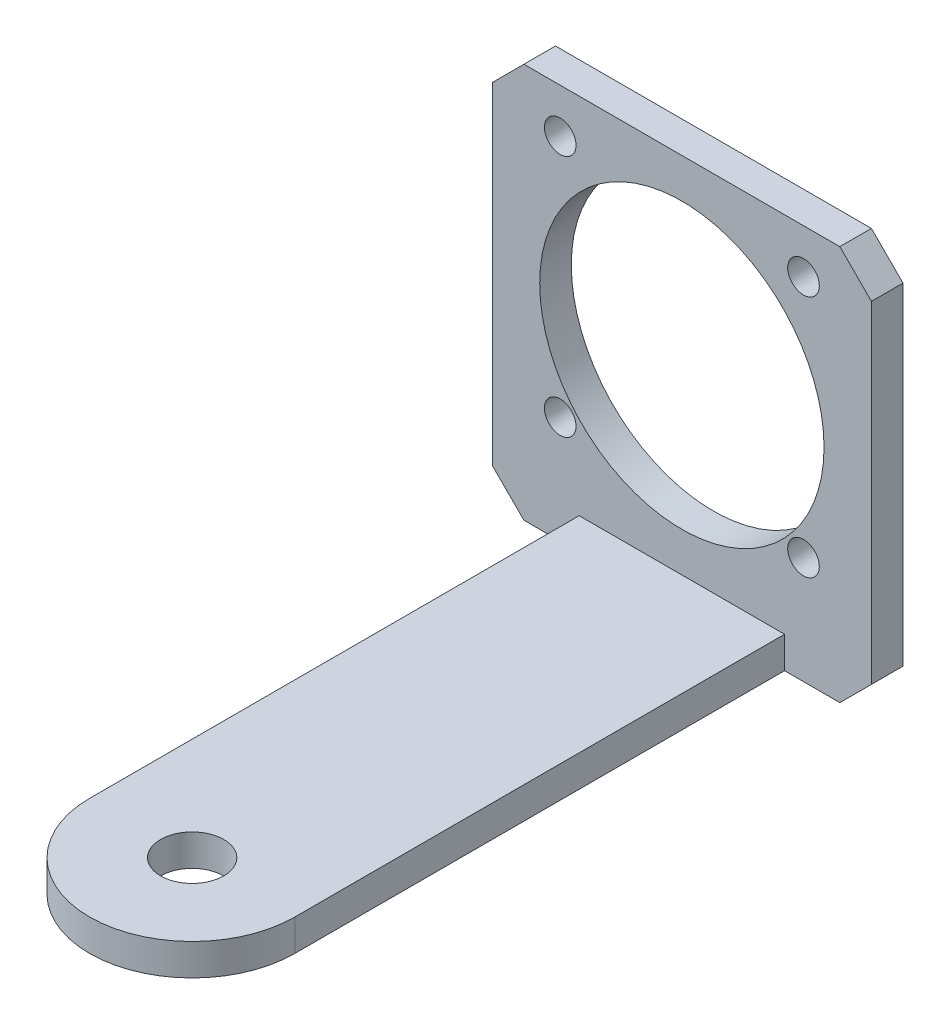
ISO-10303-21;
HEADER;
FILE_DESCRIPTION(('STEP AP214'),'2;1');
FILE_NAME('part.step','',(''),(''),'','','');
FILE_SCHEMA(('AUTOMOTIVE_DESIGN { 1 0 10303 214 1 1 1 1 }'));
ENDSEC;
DATA;
#1=APPLICATION_CONTEXT('core data for automotive mechanical design processes');
#2=APPLICATION_PROTOCOL_DEFINITION('international standard','automotive_design',2000,#1);
#3=PRODUCT_CONTEXT('',#1,'mechanical');
#4=PRODUCT('Part','Part','',(#3));
#5=PRODUCT_RELATED_PRODUCT_CATEGORY('part','',(#4));
#6=PRODUCT_DEFINITION_FORMATION('','',#4);
#7=PRODUCT_DEFINITION_CONTEXT('part definition',#1,'design');
#8=PRODUCT_DEFINITION('design','',#6,#7);
#9=PRODUCT_DEFINITION_SHAPE('','',#8);
#10=(LENGTH_UNIT() NAMED_UNIT(*) SI_UNIT(.MILLI.,.METRE.));
#11=(NAMED_UNIT(*) PLANE_ANGLE_UNIT() SI_UNIT($,.RADIAN.));
#12=(NAMED_UNIT(*) SI_UNIT($,.STERADIAN.) SOLID_ANGLE_UNIT());
#13=UNCERTAINTY_MEASURE_WITH_UNIT(LENGTH_MEASURE(1.E-05),#10,'distance_accuracy_value','');
#14=(GEOMETRIC_REPRESENTATION_CONTEXT(3) GLOBAL_UNCERTAINTY_ASSIGNED_CONTEXT((#13)) GLOBAL_UNIT_ASSIGNED_CONTEXT((#10,
#11,#12)) REPRESENTATION_CONTEXT('',''));
#15=CARTESIAN_POINT('',(0.,0.,0.));
#16=DIRECTION('',(0.,0.,1.));
#17=DIRECTION('',(1.,0.,0.));
#18=AXIS2_PLACEMENT_3D('',#15,#16,#17);
#19=CARTESIAN_POINT('',(0.,2.,0.));
#20=DIRECTION('',(0.,-1.,0.));
#21=DIRECTION('',(0.,0.,-1.));
#22=AXIS2_PLACEMENT_3D('',#19,#20,#21);
#23=CYLINDRICAL_SURFACE('',#22,6.5);
#24=DIRECTION('',(0.,1.,0.));
#25=VECTOR('',#24,1.);
#26=CARTESIAN_POINT('',(6.5,0.,0.));
#27=LINE('',#26,#25);
#28=CARTESIAN_POINT('',(6.5,0.,0.));
#29=VERTEX_POINT('',#28);
#30=CARTESIAN_POINT('',(6.5,2.,0.));
#31=VERTEX_POINT('',#30);
#32=EDGE_CURVE('E194',#29,#31,#27,.T.);
#33=ORIENTED_EDGE('',*,*,#32,.T.);
#34=CARTESIAN_POINT('',(0.,2.,0.));
#35=DIRECTION('',(0.,1.,0.));
#36=DIRECTION('',(0.,0.,1.));
#37=AXIS2_PLACEMENT_3D('',#34,#35,#36);
#38=CIRCLE('',#37,6.5);
#39=CARTESIAN_POINT('',(-6.5,2.,0.));
#40=VERTEX_POINT('',#39);
#41=EDGE_CURVE('E211',#40,#31,#38,.T.);
#42=ORIENTED_EDGE('',*,*,#41,.F.);
#43=DIRECTION('',(0.,1.,0.));
#44=VECTOR('',#43,1.);
#45=CARTESIAN_POINT('',(-6.5,0.,0.));
#46=LINE('',#45,#44);
#47=CARTESIAN_POINT('',(-6.5,0.,0.));
#48=VERTEX_POINT('',#47);
#49=EDGE_CURVE('E182',#48,#40,#46,.T.);
#50=ORIENTED_EDGE('',*,*,#49,.F.);
#51=CARTESIAN_POINT('',(0.,0.,0.));
#52=DIRECTION('',(0.,1.,0.));
#53=DIRECTION('',(0.,0.,1.));
#54=AXIS2_PLACEMENT_3D('',#51,#52,#53);
#55=CIRCLE('',#54,6.5);
#56=EDGE_CURVE('E205',#48,#29,#55,.T.);
#57=ORIENTED_EDGE('',*,*,#56,.T.);
#58=EDGE_LOOP('',(#33,#42,#50,#57));
#59=FACE_BOUND('',#58,.T.);
#60=ADVANCED_FACE('F68',(#59),#23,.T.);
#61=CARTESIAN_POINT('',(0.,2.,0.));
#62=DIRECTION('',(0.,1.,0.));
#63=DIRECTION('',(0.,0.,1.));
#64=AXIS2_PLACEMENT_3D('',#61,#62,#63);
#65=PLANE('',#64);
#66=CARTESIAN_POINT('',(0.,2.,0.));
#67=DIRECTION('',(0.,1.,0.));
#68=DIRECTION('',(0.,0.,1.));
#69=AXIS2_PLACEMENT_3D('',#66,#67,#68);
#70=CIRCLE('',#69,2.);
#71=CARTESIAN_POINT('',(0.,2.,2.));
#72=VERTEX_POINT('',#71);
#73=EDGE_CURVE('E206',#72,#72,#70,.T.);
#74=ORIENTED_EDGE('',*,*,#73,.F.);
#75=EDGE_LOOP('',(#74));
#76=FACE_BOUND('',#75,.T.);
#77=ORIENTED_EDGE('',*,*,#41,.T.);
#78=DIRECTION('',(0.,0.,-1.));
#79=VECTOR('',#78,1.);
#80=CARTESIAN_POINT('',(6.5,2.,0.));
#81=LINE('',#80,#79);
#82=CARTESIAN_POINT('',(6.5,2.,-31.));
#83=VERTEX_POINT('',#82);
#84=EDGE_CURVE('E167',#31,#83,#81,.T.);
#85=ORIENTED_EDGE('',*,*,#84,.T.);
#86=DIRECTION('',(1.,0.,0.));
#87=VECTOR('',#86,1.);
#88=CARTESIAN_POINT('',(0.,2.,-31.));
#89=LINE('',#88,#87);
#90=CARTESIAN_POINT('',(-6.5,2.,-31.));
#91=VERTEX_POINT('',#90);
#92=EDGE_CURVE('E161',#91,#83,#89,.T.);
#93=ORIENTED_EDGE('',*,*,#92,.F.);
#94=DIRECTION('',(0.,0.,-1.));
#95=VECTOR('',#94,1.);
#96=CARTESIAN_POINT('',(-6.5,2.,0.));
#97=LINE('',#96,#95);
#98=EDGE_CURVE('E165',#40,#91,#97,.T.);
#99=ORIENTED_EDGE('',*,*,#98,.F.);
#100=EDGE_LOOP('',(#77,#85,#93,#99));
#101=FACE_BOUND('',#100,.T.);
#102=ADVANCED_FACE('F164',(#76,#101),#65,.T.);
#103=CARTESIAN_POINT('',(0.,0.,0.));
#104=DIRECTION('',(0.,1.,0.));
#105=DIRECTION('',(0.,0.,1.));
#106=AXIS2_PLACEMENT_3D('',#103,#104,#105);
#107=PLANE('',#106);
#108=CARTESIAN_POINT('',(0.,0.,0.));
#109=DIRECTION('',(0.,1.,0.));
#110=DIRECTION('',(0.,0.,1.));
#111=AXIS2_PLACEMENT_3D('',#108,#109,#110);
#112=CIRCLE('',#111,2.);
#113=CARTESIAN_POINT('',(0.,0.,2.));
#114=VERTEX_POINT('',#113);
#115=EDGE_CURVE('E201',#114,#114,#112,.T.);
#116=ORIENTED_EDGE('',*,*,#115,.T.);
#117=EDGE_LOOP('',(#116));
#118=FACE_BOUND('',#117,.T.);
#119=DIRECTION('',(-1.,0.,0.));
#120=VECTOR('',#119,1.);
#121=CARTESIAN_POINT('',(0.,0.,-31.));
#122=LINE('',#121,#120);
#123=CARTESIAN_POINT('',(-6.5,0.,-31.));
#124=VERTEX_POINT('',#123);
#125=CARTESIAN_POINT('',(-9.99999999999999,0.,-31.));
#126=VERTEX_POINT('',#125);
#127=EDGE_CURVE('E188',#124,#126,#122,.T.);
#128=ORIENTED_EDGE('',*,*,#127,.T.);
#129=DIRECTION('',(0.,0.,-1.));
#130=VECTOR('',#129,1.);
#131=CARTESIAN_POINT('',(-9.99999999999999,0.,0.));
#132=LINE('',#131,#130);
#133=CARTESIAN_POINT('',(-9.99999999999999,0.,-33.));
#134=VERTEX_POINT('',#133);
#135=EDGE_CURVE('E239',#126,#134,#132,.T.);
#136=ORIENTED_EDGE('',*,*,#135,.T.);
#137=DIRECTION('',(-1.,0.,0.));
#138=VECTOR('',#137,1.);
#139=CARTESIAN_POINT('',(12.,0.,-33.));
#140=LINE('',#139,#138);
#141=CARTESIAN_POINT('',(10.,0.,-33.));
#142=VERTEX_POINT('',#141);
#143=EDGE_CURVE('E279',#142,#134,#140,.T.);
#144=ORIENTED_EDGE('',*,*,#143,.F.);
#145=DIRECTION('',(0.,0.,1.));
#146=VECTOR('',#145,1.);
#147=CARTESIAN_POINT('',(10.,0.,0.));
#148=LINE('',#147,#146);
#149=CARTESIAN_POINT('',(10.,0.,-31.));
#150=VERTEX_POINT('',#149);
#151=EDGE_CURVE('E235',#142,#150,#148,.T.);
#152=ORIENTED_EDGE('',*,*,#151,.T.);
#153=CARTESIAN_POINT('',(6.5,0.,-31.));
#154=VERTEX_POINT('',#153);
#155=EDGE_CURVE('E281',#150,#154,#122,.T.);
#156=ORIENTED_EDGE('',*,*,#155,.T.);
#157=DIRECTION('',(0.,0.,-1.));
#158=VECTOR('',#157,1.);
#159=CARTESIAN_POINT('',(6.5,0.,0.));
#160=LINE('',#159,#158);
#161=EDGE_CURVE('E190',#29,#154,#160,.T.);
#162=ORIENTED_EDGE('',*,*,#161,.F.);
#163=ORIENTED_EDGE('',*,*,#56,.F.);
#164=DIRECTION('',(0.,0.,-1.));
#165=VECTOR('',#164,1.);
#166=CARTESIAN_POINT('',(-6.5,0.,0.));
#167=LINE('',#166,#165);
#168=EDGE_CURVE('E197',#48,#124,#167,.T.);
#169=ORIENTED_EDGE('',*,*,#168,.T.);
#170=EDGE_LOOP('',(#128,#136,#144,#152,#156,#162,#163,#169));
#171=FACE_BOUND('',#170,.T.);
#172=ADVANCED_FACE('F381',(#118,#171),#107,.F.);
#173=CARTESIAN_POINT('',(0.,0.,0.));
#174=DIRECTION('',(0.,1.,0.));
#175=DIRECTION('',(0.,0.,1.));
#176=AXIS2_PLACEMENT_3D('',#173,#174,#175);
#177=CYLINDRICAL_SURFACE('',#176,2.);
#178=ORIENTED_EDGE('',*,*,#115,.F.);
#179=EDGE_LOOP('',(#178));
#180=FACE_BOUND('',#179,.T.);
#181=ORIENTED_EDGE('',*,*,#73,.T.);
#182=EDGE_LOOP('',(#181));
#183=FACE_BOUND('',#182,.T.);
#184=ADVANCED_FACE('F433',(#180,#183),#177,.F.);
#185=CARTESIAN_POINT('',(6.5,0.,0.));
#186=DIRECTION('',(1.,0.,0.));
#187=DIRECTION('',(0.,0.,-1.));
#188=AXIS2_PLACEMENT_3D('',#185,#186,#187);
#189=PLANE('',#188);
#190=ORIENTED_EDGE('',*,*,#84,.F.);
#191=ORIENTED_EDGE('',*,*,#32,.F.);
#192=ORIENTED_EDGE('',*,*,#161,.T.);
#193=DIRECTION('',(0.,1.,0.));
#194=VECTOR('',#193,1.);
#195=CARTESIAN_POINT('',(6.5,0.,-31.));
#196=LINE('',#195,#194);
#197=EDGE_CURVE('E210',#154,#83,#196,.T.);
#198=ORIENTED_EDGE('',*,*,#197,.T.);
#199=EDGE_LOOP('',(#190,#191,#192,#198));
#200=FACE_BOUND('',#199,.T.);
#201=ADVANCED_FACE('F295',(#200),#189,.T.);
#202=CARTESIAN_POINT('',(-6.5,0.,0.));
#203=DIRECTION('',(1.,0.,0.));
#204=DIRECTION('',(0.,0.,-1.));
#205=AXIS2_PLACEMENT_3D('',#202,#203,#204);
#206=PLANE('',#205);
#207=ORIENTED_EDGE('',*,*,#98,.T.);
#208=DIRECTION('',(0.,1.,0.));
#209=VECTOR('',#208,1.);
#210=CARTESIAN_POINT('',(-6.5,0.,-31.));
#211=LINE('',#210,#209);
#212=EDGE_CURVE('E179',#124,#91,#211,.T.);
#213=ORIENTED_EDGE('',*,*,#212,.F.);
#214=ORIENTED_EDGE('',*,*,#168,.F.);
#215=ORIENTED_EDGE('',*,*,#49,.T.);
#216=EDGE_LOOP('',(#207,#213,#214,#215));
#217=FACE_BOUND('',#216,.T.);
#218=ADVANCED_FACE('F177',(#217),#206,.F.);
#219=CARTESIAN_POINT('',(-12.,0.,-33.));
#220=DIRECTION('',(1.,0.,0.));
#221=DIRECTION('',(0.,0.,-1.));
#222=AXIS2_PLACEMENT_3D('',#219,#220,#221);
#223=PLANE('',#222);
#224=DIRECTION('',(0.,1.,0.));
#225=VECTOR('',#224,1.);
#226=CARTESIAN_POINT('',(-12.,0.,-33.));
#227=LINE('',#226,#225);
#228=CARTESIAN_POINT('',(-12.,2.00000000000001,-33.));
#229=VERTEX_POINT('',#228);
#230=CARTESIAN_POINT('',(-12.,23.,-33.));
#231=VERTEX_POINT('',#230);
#232=EDGE_CURVE('E306',#229,#231,#227,.T.);
#233=ORIENTED_EDGE('',*,*,#232,.F.);
#234=DIRECTION('',(0.,0.,1.));
#235=VECTOR('',#234,1.);
#236=CARTESIAN_POINT('',(-12.,2.00000000000001,-33.));
#237=LINE('',#236,#235);
#238=CARTESIAN_POINT('',(-12.,2.00000000000001,-31.));
#239=VERTEX_POINT('',#238);
#240=EDGE_CURVE('E219',#229,#239,#237,.T.);
#241=ORIENTED_EDGE('',*,*,#240,.T.);
#242=DIRECTION('',(0.,1.,0.));
#243=VECTOR('',#242,1.);
#244=CARTESIAN_POINT('',(-12.,0.,-31.));
#245=LINE('',#244,#243);
#246=CARTESIAN_POINT('',(-12.,23.,-31.));
#247=VERTEX_POINT('',#246);
#248=EDGE_CURVE('E275',#239,#247,#245,.T.);
#249=ORIENTED_EDGE('',*,*,#248,.T.);
#250=DIRECTION('',(0.,0.,-1.));
#251=VECTOR('',#250,1.);
#252=CARTESIAN_POINT('',(-12.,23.,-33.));
#253=LINE('',#252,#251);
#254=EDGE_CURVE('E214',#247,#231,#253,.T.);
#255=ORIENTED_EDGE('',*,*,#254,.T.);
#256=EDGE_LOOP('',(#233,#241,#249,#255));
#257=FACE_BOUND('',#256,.T.);
#258=ADVANCED_FACE('F419',(#257),#223,.F.);
#259=CARTESIAN_POINT('',(-12.,25.,-33.));
#260=DIRECTION('',(0.,-1.,0.));
#261=DIRECTION('',(1.,0.,0.));
#262=AXIS2_PLACEMENT_3D('',#259,#260,#261);
#263=PLANE('',#262);
#264=DIRECTION('',(1.,0.,0.));
#265=VECTOR('',#264,1.);
#266=CARTESIAN_POINT('',(-12.,25.,-31.));
#267=LINE('',#266,#265);
#268=CARTESIAN_POINT('',(-9.99999999999999,25.,-31.));
#269=VERTEX_POINT('',#268);
#270=CARTESIAN_POINT('',(10.,25.,-31.));
#271=VERTEX_POINT('',#270);
#272=EDGE_CURVE('E266',#269,#271,#267,.T.);
#273=ORIENTED_EDGE('',*,*,#272,.T.);
#274=DIRECTION('',(0.,0.,-1.));
#275=VECTOR('',#274,1.);
#276=CARTESIAN_POINT('',(10.,25.,-33.));
#277=LINE('',#276,#275);
#278=CARTESIAN_POINT('',(10.,25.,-33.));
#279=VERTEX_POINT('',#278);
#280=EDGE_CURVE('E12',#271,#279,#277,.T.);
#281=ORIENTED_EDGE('',*,*,#280,.T.);
#282=DIRECTION('',(1.,0.,0.));
#283=VECTOR('',#282,1.);
#284=CARTESIAN_POINT('',(-12.,25.,-33.));
#285=LINE('',#284,#283);
#286=CARTESIAN_POINT('',(-9.99999999999999,25.,-33.));
#287=VERTEX_POINT('',#286);
#288=EDGE_CURVE('E268',#287,#279,#285,.T.);
#289=ORIENTED_EDGE('',*,*,#288,.F.);
#290=DIRECTION('',(0.,0.,1.));
#291=VECTOR('',#290,1.);
#292=CARTESIAN_POINT('',(-9.99999999999999,25.,-33.));
#293=LINE('',#292,#291);
#294=EDGE_CURVE('E78',#287,#269,#293,.T.);
#295=ORIENTED_EDGE('',*,*,#294,.T.);
#296=EDGE_LOOP('',(#273,#281,#289,#295));
#297=FACE_BOUND('',#296,.T.);
#298=ADVANCED_FACE('F265',(#297),#263,.F.);
#299=CARTESIAN_POINT('',(12.,25.,-33.));
#300=DIRECTION('',(-1.,0.,0.));
#301=DIRECTION('',(0.,0.,1.));
#302=AXIS2_PLACEMENT_3D('',#299,#300,#301);
#303=PLANE('',#302);
#304=DIRECTION('',(0.,-1.,0.));
#305=VECTOR('',#304,1.);
#306=CARTESIAN_POINT('',(12.,25.,-31.));
#307=LINE('',#306,#305);
#308=CARTESIAN_POINT('',(12.,23.,-31.));
#309=VERTEX_POINT('',#308);
#310=CARTESIAN_POINT('',(12.,2.00000000000001,-31.));
#311=VERTEX_POINT('',#310);
#312=EDGE_CURVE('E274',#309,#311,#307,.T.);
#313=ORIENTED_EDGE('',*,*,#312,.T.);
#314=DIRECTION('',(0.,0.,-1.));
#315=VECTOR('',#314,1.);
#316=CARTESIAN_POINT('',(12.,2.,-33.));
#317=LINE('',#316,#315);
#318=CARTESIAN_POINT('',(12.,2.00000000000001,-33.));
#319=VERTEX_POINT('',#318);
#320=EDGE_CURVE('E85',#311,#319,#317,.T.);
#321=ORIENTED_EDGE('',*,*,#320,.T.);
#322=DIRECTION('',(0.,-1.,0.));
#323=VECTOR('',#322,1.);
#324=CARTESIAN_POINT('',(12.,25.,-33.));
#325=LINE('',#324,#323);
#326=CARTESIAN_POINT('',(12.,23.,-33.));
#327=VERTEX_POINT('',#326);
#328=EDGE_CURVE('E172',#327,#319,#325,.T.);
#329=ORIENTED_EDGE('',*,*,#328,.F.);
#330=DIRECTION('',(0.,0.,1.));
#331=VECTOR('',#330,1.);
#332=CARTESIAN_POINT('',(12.,23.,-33.));
#333=LINE('',#332,#331);
#334=EDGE_CURVE('E253',#327,#309,#333,.T.);
#335=ORIENTED_EDGE('',*,*,#334,.T.);
#336=EDGE_LOOP('',(#313,#321,#329,#335));
#337=FACE_BOUND('',#336,.T.);
#338=ADVANCED_FACE('F410',(#337),#303,.F.);
#339=CARTESIAN_POINT('',(0.,0.,-33.));
#340=DIRECTION('',(0.,0.,-1.));
#341=DIRECTION('',(-1.,0.,0.));
#342=AXIS2_PLACEMENT_3D('',#339,#340,#341);
#343=PLANE('',#342);
#344=CARTESIAN_POINT('',(-7.7,22.2,-33.));
#345=DIRECTION('',(0.,0.,1.));
#346=DIRECTION('',(1.,0.,0.));
#347=AXIS2_PLACEMENT_3D('',#344,#345,#346);
#348=CIRCLE('',#347,1.);
#349=CARTESIAN_POINT('',(-6.7,22.2,-33.));
#350=VERTEX_POINT('',#349);
#351=EDGE_CURVE('E321',#350,#350,#348,.T.);
#352=ORIENTED_EDGE('',*,*,#351,.T.);
#353=EDGE_LOOP('',(#352));
#354=FACE_BOUND('',#353,.T.);
#355=CARTESIAN_POINT('',(7.7,22.2,-33.));
#356=DIRECTION('',(0.,0.,1.));
#357=DIRECTION('',(1.,0.,0.));
#358=AXIS2_PLACEMENT_3D('',#355,#356,#357);
#359=CIRCLE('',#358,1.);
#360=CARTESIAN_POINT('',(8.7,22.2,-33.));
#361=VERTEX_POINT('',#360);
#362=EDGE_CURVE('E329',#361,#361,#359,.T.);
#363=ORIENTED_EDGE('',*,*,#362,.T.);
#364=EDGE_LOOP('',(#363));
#365=FACE_BOUND('',#364,.T.);
#366=CARTESIAN_POINT('',(7.7,6.8,-33.));
#367=DIRECTION('',(0.,0.,1.));
#368=DIRECTION('',(1.,0.,0.));
#369=AXIS2_PLACEMENT_3D('',#366,#367,#368);
#370=CIRCLE('',#369,1.);
#371=CARTESIAN_POINT('',(8.7,6.8,-33.));
#372=VERTEX_POINT('',#371);
#373=EDGE_CURVE('E337',#372,#372,#370,.T.);
#374=ORIENTED_EDGE('',*,*,#373,.T.);
#375=EDGE_LOOP('',(#374));
#376=FACE_BOUND('',#375,.T.);
#377=CARTESIAN_POINT('',(-7.7,6.8,-33.));
#378=DIRECTION('',(0.,0.,1.));
#379=DIRECTION('',(1.,0.,0.));
#380=AXIS2_PLACEMENT_3D('',#377,#378,#379);
#381=CIRCLE('',#380,1.);
#382=CARTESIAN_POINT('',(-6.7,6.8,-33.));
#383=VERTEX_POINT('',#382);
#384=EDGE_CURVE('E345',#383,#383,#381,.T.);
#385=ORIENTED_EDGE('',*,*,#384,.T.);
#386=EDGE_LOOP('',(#385));
#387=FACE_BOUND('',#386,.T.);
#388=CARTESIAN_POINT('',(0.,13.5,-33.));
#389=DIRECTION('',(0.,0.,1.));
#390=DIRECTION('',(1.,0.,0.));
#391=AXIS2_PLACEMENT_3D('',#388,#389,#390);
#392=CIRCLE('',#391,9.);
#393=CARTESIAN_POINT('',(9.,13.5,-33.));
#394=VERTEX_POINT('',#393);
#395=EDGE_CURVE('E300',#394,#394,#392,.T.);
#396=ORIENTED_EDGE('',*,*,#395,.T.);
#397=EDGE_LOOP('',(#396));
#398=FACE_BOUND('',#397,.T.);
#399=ORIENTED_EDGE('',*,*,#143,.T.);
#400=DIRECTION('',(0.707106781186548,-0.707106781186548,0.));
#401=VECTOR('',#400,1.);
#402=CARTESIAN_POINT('',(-5.,-5.,-33.));
#403=LINE('',#402,#401);
#404=EDGE_CURVE('E250',#134,#229,#403,.F.);
#405=ORIENTED_EDGE('',*,*,#404,.T.);
#406=ORIENTED_EDGE('',*,*,#232,.T.);
#407=DIRECTION('',(-0.707106781186548,-0.707106781186548,0.));
#408=VECTOR('',#407,1.);
#409=CARTESIAN_POINT('',(-17.5,17.5,-33.));
#410=LINE('',#409,#408);
#411=EDGE_CURVE('E242',#231,#287,#410,.F.);
#412=ORIENTED_EDGE('',*,*,#411,.T.);
#413=ORIENTED_EDGE('',*,*,#288,.T.);
#414=DIRECTION('',(-0.707106781186548,0.707106781186548,0.));
#415=VECTOR('',#414,1.);
#416=CARTESIAN_POINT('',(17.5,17.5,-33.));
#417=LINE('',#416,#415);
#418=EDGE_CURVE('E92',#279,#327,#417,.F.);
#419=ORIENTED_EDGE('',*,*,#418,.T.);
#420=ORIENTED_EDGE('',*,*,#328,.T.);
#421=DIRECTION('',(0.707106781186548,0.707106781186548,0.));
#422=VECTOR('',#421,1.);
#423=CARTESIAN_POINT('',(5.,-5.,-33.));
#424=LINE('',#423,#422);
#425=EDGE_CURVE('E247',#319,#142,#424,.F.);
#426=ORIENTED_EDGE('',*,*,#425,.T.);
#427=EDGE_LOOP('',(#399,#405,#406,#412,#413,#419,#420,#426));
#428=FACE_BOUND('',#427,.T.);
#429=ADVANCED_FACE('F358',(#354,#365,#376,#387,#398,#428),#343,.T.);
#430=CARTESIAN_POINT('',(0.,0.,-31.));
#431=DIRECTION('',(0.,0.,-1.));
#432=DIRECTION('',(-1.,0.,0.));
#433=AXIS2_PLACEMENT_3D('',#430,#431,#432);
#434=PLANE('',#433);
#435=CARTESIAN_POINT('',(-7.7,22.2,-31.));
#436=DIRECTION('',(0.,0.,1.));
#437=DIRECTION('',(1.,0.,0.));
#438=AXIS2_PLACEMENT_3D('',#435,#436,#437);
#439=CIRCLE('',#438,1.);
#440=CARTESIAN_POINT('',(-6.7,22.2,-31.));
#441=VERTEX_POINT('',#440);
#442=EDGE_CURVE('E325',#441,#441,#439,.T.);
#443=ORIENTED_EDGE('',*,*,#442,.F.);
#444=EDGE_LOOP('',(#443));
#445=FACE_BOUND('',#444,.T.);
#446=CARTESIAN_POINT('',(7.7,22.2,-31.));
#447=DIRECTION('',(0.,0.,1.));
#448=DIRECTION('',(1.,0.,0.));
#449=AXIS2_PLACEMENT_3D('',#446,#447,#448);
#450=CIRCLE('',#449,1.);
#451=CARTESIAN_POINT('',(8.7,22.2,-31.));
#452=VERTEX_POINT('',#451);
#453=EDGE_CURVE('E333',#452,#452,#450,.T.);
#454=ORIENTED_EDGE('',*,*,#453,.F.);
#455=EDGE_LOOP('',(#454));
#456=FACE_BOUND('',#455,.T.);
#457=CARTESIAN_POINT('',(7.7,6.8,-31.));
#458=DIRECTION('',(0.,0.,1.));
#459=DIRECTION('',(1.,0.,0.));
#460=AXIS2_PLACEMENT_3D('',#457,#458,#459);
#461=CIRCLE('',#460,1.);
#462=CARTESIAN_POINT('',(8.7,6.8,-31.));
#463=VERTEX_POINT('',#462);
#464=EDGE_CURVE('E341',#463,#463,#461,.T.);
#465=ORIENTED_EDGE('',*,*,#464,.F.);
#466=EDGE_LOOP('',(#465));
#467=FACE_BOUND('',#466,.T.);
#468=CARTESIAN_POINT('',(-7.7,6.8,-31.));
#469=DIRECTION('',(0.,0.,1.));
#470=DIRECTION('',(1.,0.,0.));
#471=AXIS2_PLACEMENT_3D('',#468,#469,#470);
#472=CIRCLE('',#471,1.);
#473=CARTESIAN_POINT('',(-6.7,6.8,-31.));
#474=VERTEX_POINT('',#473);
#475=EDGE_CURVE('E317',#474,#474,#472,.T.);
#476=ORIENTED_EDGE('',*,*,#475,.F.);
#477=EDGE_LOOP('',(#476));
#478=FACE_BOUND('',#477,.T.);
#479=CARTESIAN_POINT('',(0.,13.5,-31.));
#480=DIRECTION('',(0.,0.,1.));
#481=DIRECTION('',(1.,0.,0.));
#482=AXIS2_PLACEMENT_3D('',#479,#480,#481);
#483=CIRCLE('',#482,9.);
#484=CARTESIAN_POINT('',(9.,13.5,-31.));
#485=VERTEX_POINT('',#484);
#486=EDGE_CURVE('E313',#485,#485,#483,.T.);
#487=ORIENTED_EDGE('',*,*,#486,.F.);
#488=EDGE_LOOP('',(#487));
#489=FACE_BOUND('',#488,.T.);
#490=ORIENTED_EDGE('',*,*,#248,.F.);
#491=DIRECTION('',(-0.707106781186548,0.707106781186548,0.));
#492=VECTOR('',#491,1.);
#493=CARTESIAN_POINT('',(-12.,2.00000000000001,-31.));
#494=LINE('',#493,#492);
#495=EDGE_CURVE('E232',#239,#126,#494,.F.);
#496=ORIENTED_EDGE('',*,*,#495,.T.);
#497=ORIENTED_EDGE('',*,*,#127,.F.);
#498=ORIENTED_EDGE('',*,*,#212,.T.);
#499=ORIENTED_EDGE('',*,*,#92,.T.);
#500=ORIENTED_EDGE('',*,*,#197,.F.);
#501=ORIENTED_EDGE('',*,*,#155,.F.);
#502=DIRECTION('',(-0.707106781186548,-0.707106781186548,0.));
#503=VECTOR('',#502,1.);
#504=CARTESIAN_POINT('',(10.,0.,-31.));
#505=LINE('',#504,#503);
#506=EDGE_CURVE('E229',#150,#311,#505,.F.);
#507=ORIENTED_EDGE('',*,*,#506,.T.);
#508=ORIENTED_EDGE('',*,*,#312,.F.);
#509=DIRECTION('',(0.707106781186548,-0.707106781186548,0.));
#510=VECTOR('',#509,1.);
#511=CARTESIAN_POINT('',(12.,23.,-31.));
#512=LINE('',#511,#510);
#513=EDGE_CURVE('E226',#309,#271,#512,.F.);
#514=ORIENTED_EDGE('',*,*,#513,.T.);
#515=ORIENTED_EDGE('',*,*,#272,.F.);
#516=DIRECTION('',(0.707106781186548,0.707106781186548,0.));
#517=VECTOR('',#516,1.);
#518=CARTESIAN_POINT('',(-9.99999999999999,25.,-31.));
#519=LINE('',#518,#517);
#520=EDGE_CURVE('E223',#269,#247,#519,.F.);
#521=ORIENTED_EDGE('',*,*,#520,.T.);
#522=EDGE_LOOP('',(#490,#496,#497,#498,#499,#500,#501,#507,#508,#514,#515,#521));
#523=FACE_BOUND('',#522,.T.);
#524=ADVANCED_FACE('F186',(#445,#456,#467,#478,#489,#523),#434,.F.);
#525=CARTESIAN_POINT('',(0.,13.5,-33.));
#526=DIRECTION('',(0.,0.,1.));
#527=DIRECTION('',(1.,0.,0.));
#528=AXIS2_PLACEMENT_3D('',#525,#526,#527);
#529=CYLINDRICAL_SURFACE('',#528,9.);
#530=ORIENTED_EDGE('',*,*,#395,.F.);
#531=EDGE_LOOP('',(#530));
#532=FACE_BOUND('',#531,.T.);
#533=ORIENTED_EDGE('',*,*,#486,.T.);
#534=EDGE_LOOP('',(#533));
#535=FACE_BOUND('',#534,.T.);
#536=ADVANCED_FACE('F357',(#532,#535),#529,.F.);
#537=CARTESIAN_POINT('',(-7.7,6.8,-33.));
#538=DIRECTION('',(0.,0.,1.));
#539=DIRECTION('',(1.,0.,0.));
#540=AXIS2_PLACEMENT_3D('',#537,#538,#539);
#541=CYLINDRICAL_SURFACE('',#540,1.);
#542=ORIENTED_EDGE('',*,*,#384,.F.);
#543=EDGE_LOOP('',(#542));
#544=FACE_BOUND('',#543,.T.);
#545=ORIENTED_EDGE('',*,*,#475,.T.);
#546=EDGE_LOOP('',(#545));
#547=FACE_BOUND('',#546,.T.);
#548=ADVANCED_FACE('F353',(#544,#547),#541,.F.);
#549=CARTESIAN_POINT('',(7.7,6.8,-33.));
#550=DIRECTION('',(0.,0.,1.));
#551=DIRECTION('',(1.,0.,0.));
#552=AXIS2_PLACEMENT_3D('',#549,#550,#551);
#553=CYLINDRICAL_SURFACE('',#552,1.);
#554=ORIENTED_EDGE('',*,*,#373,.F.);
#555=EDGE_LOOP('',(#554));
#556=FACE_BOUND('',#555,.T.);
#557=ORIENTED_EDGE('',*,*,#464,.T.);
#558=EDGE_LOOP('',(#557));
#559=FACE_BOUND('',#558,.T.);
#560=ADVANCED_FACE('F370',(#556,#559),#553,.F.);
#561=CARTESIAN_POINT('',(7.7,22.2,-33.));
#562=DIRECTION('',(0.,0.,1.));
#563=DIRECTION('',(1.,0.,0.));
#564=AXIS2_PLACEMENT_3D('',#561,#562,#563);
#565=CYLINDRICAL_SURFACE('',#564,1.);
#566=ORIENTED_EDGE('',*,*,#362,.F.);
#567=EDGE_LOOP('',(#566));
#568=FACE_BOUND('',#567,.T.);
#569=ORIENTED_EDGE('',*,*,#453,.T.);
#570=EDGE_LOOP('',(#569));
#571=FACE_BOUND('',#570,.T.);
#572=ADVANCED_FACE('F452',(#568,#571),#565,.F.);
#573=CARTESIAN_POINT('',(-7.7,22.2,-33.));
#574=DIRECTION('',(0.,0.,1.));
#575=DIRECTION('',(1.,0.,0.));
#576=AXIS2_PLACEMENT_3D('',#573,#574,#575);
#577=CYLINDRICAL_SURFACE('',#576,1.);
#578=ORIENTED_EDGE('',*,*,#351,.F.);
#579=EDGE_LOOP('',(#578));
#580=FACE_BOUND('',#579,.T.);
#581=ORIENTED_EDGE('',*,*,#442,.T.);
#582=EDGE_LOOP('',(#581));
#583=FACE_BOUND('',#582,.T.);
#584=ADVANCED_FACE('F394',(#580,#583),#577,.F.);
#585=CARTESIAN_POINT('',(-12.,2.00000000000001,-33.));
#586=DIRECTION('',(0.707106781186548,0.707106781186548,0.));
#587=DIRECTION('',(0.,0.,1.));
#588=AXIS2_PLACEMENT_3D('',#585,#586,#587);
#589=PLANE('',#588);
#590=ORIENTED_EDGE('',*,*,#404,.F.);
#591=ORIENTED_EDGE('',*,*,#135,.F.);
#592=ORIENTED_EDGE('',*,*,#495,.F.);
#593=ORIENTED_EDGE('',*,*,#240,.F.);
#594=EDGE_LOOP('',(#590,#591,#592,#593));
#595=FACE_BOUND('',#594,.T.);
#596=ADVANCED_FACE('F387',(#595),#589,.F.);
#597=CARTESIAN_POINT('',(10.,0.,0.));
#598=DIRECTION('',(-0.707106781186547,0.707106781186547,0.));
#599=DIRECTION('',(0.,0.,1.));
#600=AXIS2_PLACEMENT_3D('',#597,#598,#599);
#601=PLANE('',#600);
#602=ORIENTED_EDGE('',*,*,#425,.F.);
#603=ORIENTED_EDGE('',*,*,#320,.F.);
#604=ORIENTED_EDGE('',*,*,#506,.F.);
#605=ORIENTED_EDGE('',*,*,#151,.F.);
#606=EDGE_LOOP('',(#602,#603,#604,#605));
#607=FACE_BOUND('',#606,.T.);
#608=ADVANCED_FACE('F393',(#607),#601,.F.);
#609=CARTESIAN_POINT('',(12.,23.,-33.));
#610=DIRECTION('',(-0.707106781186547,-0.707106781186547,0.));
#611=DIRECTION('',(0.,0.,1.));
#612=AXIS2_PLACEMENT_3D('',#609,#610,#611);
#613=PLANE('',#612);
#614=ORIENTED_EDGE('',*,*,#418,.F.);
#615=ORIENTED_EDGE('',*,*,#280,.F.);
#616=ORIENTED_EDGE('',*,*,#513,.F.);
#617=ORIENTED_EDGE('',*,*,#334,.F.);
#618=EDGE_LOOP('',(#614,#615,#616,#617));
#619=FACE_BOUND('',#618,.T.);
#620=ADVANCED_FACE('F400',(#619),#613,.F.);
#621=CARTESIAN_POINT('',(-9.99999999999999,25.,-33.));
#622=DIRECTION('',(0.707106781186548,-0.707106781186548,0.));
#623=DIRECTION('',(0.,0.,1.));
#624=AXIS2_PLACEMENT_3D('',#621,#622,#623);
#625=PLANE('',#624);
#626=ORIENTED_EDGE('',*,*,#411,.F.);
#627=ORIENTED_EDGE('',*,*,#254,.F.);
#628=ORIENTED_EDGE('',*,*,#520,.F.);
#629=ORIENTED_EDGE('',*,*,#294,.F.);
#630=EDGE_LOOP('',(#626,#627,#628,#629));
#631=FACE_BOUND('',#630,.T.);
#632=ADVANCED_FACE('F71',(#631),#625,.F.);
#633=CLOSED_SHELL('',(#60,#102,#172,#184,#201,#218,#258,#298,#338,#429,#524,#536,#548,#560,#572,
#584,#596,#608,#620,#632));
#634=MANIFOLD_SOLID_BREP('B2',#633);
#635=ADVANCED_BREP_SHAPE_REPRESENTATION('',(#18,#634),#14);
#636=SHAPE_DEFINITION_REPRESENTATION(#9,#635);
ENDSEC;
END-ISO-10303-21;
